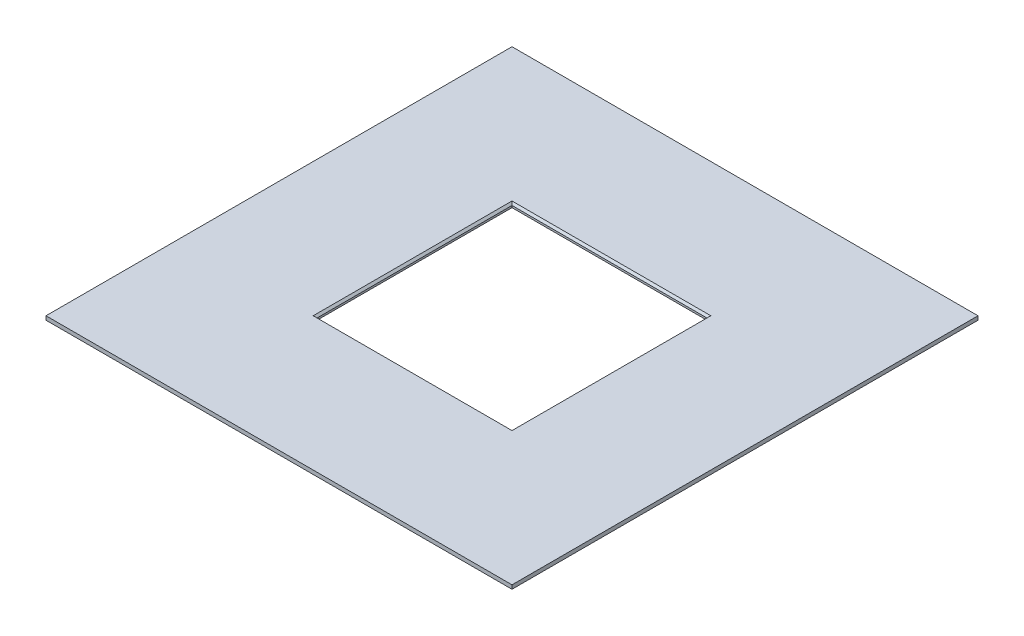
ISO-10303-21;
HEADER;
FILE_DESCRIPTION(('STEP AP214'),'2;1');
FILE_NAME('part.step','',(''),(''),'','','');
FILE_SCHEMA(('AUTOMOTIVE_DESIGN { 1 0 10303 214 1 1 1 1 }'));
ENDSEC;
DATA;
#1=APPLICATION_CONTEXT('core data for automotive mechanical design processes');
#2=APPLICATION_PROTOCOL_DEFINITION('international standard','automotive_design',2000,#1);
#3=PRODUCT_CONTEXT('',#1,'mechanical');
#4=PRODUCT('Part','Part','',(#3));
#5=PRODUCT_RELATED_PRODUCT_CATEGORY('part','',(#4));
#6=PRODUCT_DEFINITION_FORMATION('','',#4);
#7=PRODUCT_DEFINITION_CONTEXT('part definition',#1,'design');
#8=PRODUCT_DEFINITION('design','',#6,#7);
#9=PRODUCT_DEFINITION_SHAPE('','',#8);
#10=(LENGTH_UNIT() NAMED_UNIT(*) SI_UNIT(.MILLI.,.METRE.));
#11=(NAMED_UNIT(*) PLANE_ANGLE_UNIT() SI_UNIT($,.RADIAN.));
#12=(NAMED_UNIT(*) SI_UNIT($,.STERADIAN.) SOLID_ANGLE_UNIT());
#13=UNCERTAINTY_MEASURE_WITH_UNIT(LENGTH_MEASURE(1.E-05),#10,'distance_accuracy_value','');
#14=(GEOMETRIC_REPRESENTATION_CONTEXT(3) GLOBAL_UNCERTAINTY_ASSIGNED_CONTEXT((#13)) GLOBAL_UNIT_ASSIGNED_CONTEXT((#10,
#11,#12)) REPRESENTATION_CONTEXT('',''));
#15=CARTESIAN_POINT('',(0.,0.,0.));
#16=DIRECTION('',(0.,0.,1.));
#17=DIRECTION('',(1.,0.,0.));
#18=AXIS2_PLACEMENT_3D('',#15,#16,#17);
#19=CARTESIAN_POINT('',(0.,1.,0.));
#20=DIRECTION('',(0.,1.,0.));
#21=DIRECTION('',(0.,0.,1.));
#22=AXIS2_PLACEMENT_3D('',#19,#20,#21);
#23=PLANE('',#22);
#24=DIRECTION('',(0.,0.,1.));
#25=VECTOR('',#24,1.);
#26=CARTESIAN_POINT('',(25.6,1.,0.));
#27=LINE('',#26,#25);
#28=CARTESIAN_POINT('',(25.6,1.,-25.6));
#29=VERTEX_POINT('',#28);
#30=CARTESIAN_POINT('',(25.6,1.,25.6));
#31=VERTEX_POINT('',#30);
#32=EDGE_CURVE('E210',#29,#31,#27,.T.);
#33=ORIENTED_EDGE('',*,*,#32,.T.);
#34=DIRECTION('',(-1.,0.,0.));
#35=VECTOR('',#34,1.);
#36=CARTESIAN_POINT('',(0.,1.,25.6));
#37=LINE('',#36,#35);
#38=CARTESIAN_POINT('',(-25.6,1.,25.6));
#39=VERTEX_POINT('',#38);
#40=EDGE_CURVE('E213',#31,#39,#37,.T.);
#41=ORIENTED_EDGE('',*,*,#40,.T.);
#42=DIRECTION('',(0.,0.,-1.));
#43=VECTOR('',#42,1.);
#44=CARTESIAN_POINT('',(-25.6,1.,0.));
#45=LINE('',#44,#43);
#46=CARTESIAN_POINT('',(-25.6,1.,-25.6));
#47=VERTEX_POINT('',#46);
#48=EDGE_CURVE('E204',#39,#47,#45,.T.);
#49=ORIENTED_EDGE('',*,*,#48,.T.);
#50=DIRECTION('',(1.,0.,0.));
#51=VECTOR('',#50,1.);
#52=CARTESIAN_POINT('',(0.,1.,-25.6));
#53=LINE('',#52,#51);
#54=EDGE_CURVE('E207',#47,#29,#53,.T.);
#55=ORIENTED_EDGE('',*,*,#54,.T.);
#56=EDGE_LOOP('',(#33,#41,#49,#55));
#57=FACE_BOUND('',#56,.T.);
#58=DIRECTION('',(0.,0.,-1.));
#59=VECTOR('',#58,1.);
#60=CARTESIAN_POINT('',(60.,1.,-60.));
#61=LINE('',#60,#59);
#62=CARTESIAN_POINT('',(60.,1.,60.));
#63=VERTEX_POINT('',#62);
#64=CARTESIAN_POINT('',(60.,1.,-60.));
#65=VERTEX_POINT('',#64);
#66=EDGE_CURVE('E159',#63,#65,#61,.T.);
#67=ORIENTED_EDGE('',*,*,#66,.T.);
#68=DIRECTION('',(-1.,0.,0.));
#69=VECTOR('',#68,1.);
#70=CARTESIAN_POINT('',(-60.,1.,-60.));
#71=LINE('',#70,#69);
#72=CARTESIAN_POINT('',(-60.,1.,-60.));
#73=VERTEX_POINT('',#72);
#74=EDGE_CURVE('E163',#65,#73,#71,.T.);
#75=ORIENTED_EDGE('',*,*,#74,.T.);
#76=DIRECTION('',(0.,0.,1.));
#77=VECTOR('',#76,1.);
#78=CARTESIAN_POINT('',(-60.,1.,-60.));
#79=LINE('',#78,#77);
#80=CARTESIAN_POINT('',(-60.,1.,60.));
#81=VERTEX_POINT('',#80);
#82=EDGE_CURVE('E167',#73,#81,#79,.T.);
#83=ORIENTED_EDGE('',*,*,#82,.T.);
#84=DIRECTION('',(1.,0.,0.));
#85=VECTOR('',#84,1.);
#86=CARTESIAN_POINT('',(-60.,1.,60.));
#87=LINE('',#86,#85);
#88=EDGE_CURVE('E170',#81,#63,#87,.T.);
#89=ORIENTED_EDGE('',*,*,#88,.T.);
#90=EDGE_LOOP('',(#67,#75,#83,#89));
#91=FACE_BOUND('',#90,.T.);
#92=ADVANCED_FACE('F41',(#57,#91),#23,.T.);
#93=CARTESIAN_POINT('',(0.,0.,0.));
#94=DIRECTION('',(0.,1.,0.));
#95=DIRECTION('',(0.,0.,1.));
#96=AXIS2_PLACEMENT_3D('',#93,#94,#95);
#97=PLANE('',#96);
#98=DIRECTION('',(0.,0.,-1.));
#99=VECTOR('',#98,1.);
#100=CARTESIAN_POINT('',(60.,0.,-60.));
#101=LINE('',#100,#99);
#102=CARTESIAN_POINT('',(60.,0.,60.));
#103=VERTEX_POINT('',#102);
#104=CARTESIAN_POINT('',(60.,0.,-60.));
#105=VERTEX_POINT('',#104);
#106=EDGE_CURVE('E126',#103,#105,#101,.T.);
#107=ORIENTED_EDGE('',*,*,#106,.F.);
#108=DIRECTION('',(1.,0.,0.));
#109=VECTOR('',#108,1.);
#110=CARTESIAN_POINT('',(-60.,0.,60.));
#111=LINE('',#110,#109);
#112=CARTESIAN_POINT('',(-60.,0.,60.));
#113=VERTEX_POINT('',#112);
#114=EDGE_CURVE('E164',#113,#103,#111,.T.);
#115=ORIENTED_EDGE('',*,*,#114,.F.);
#116=DIRECTION('',(0.,0.,1.));
#117=VECTOR('',#116,1.);
#118=CARTESIAN_POINT('',(-60.,0.,-60.));
#119=LINE('',#118,#117);
#120=CARTESIAN_POINT('',(-60.,0.,-60.));
#121=VERTEX_POINT('',#120);
#122=EDGE_CURVE('E180',#121,#113,#119,.T.);
#123=ORIENTED_EDGE('',*,*,#122,.F.);
#124=DIRECTION('',(-1.,0.,0.));
#125=VECTOR('',#124,1.);
#126=CARTESIAN_POINT('',(-60.,0.,-60.));
#127=LINE('',#126,#125);
#128=EDGE_CURVE('E177',#105,#121,#127,.T.);
#129=ORIENTED_EDGE('',*,*,#128,.F.);
#130=EDGE_LOOP('',(#107,#115,#123,#129));
#131=FACE_BOUND('',#130,.T.);
#132=DIRECTION('',(0.,0.,-1.));
#133=VECTOR('',#132,1.);
#134=CARTESIAN_POINT('',(25.1,0.,-25.1));
#135=LINE('',#134,#133);
#136=CARTESIAN_POINT('',(25.1,0.,25.1));
#137=VERTEX_POINT('',#136);
#138=CARTESIAN_POINT('',(25.1,0.,-25.1));
#139=VERTEX_POINT('',#138);
#140=EDGE_CURVE('E123',#137,#139,#135,.T.);
#141=ORIENTED_EDGE('',*,*,#140,.T.);
#142=DIRECTION('',(-1.,0.,0.));
#143=VECTOR('',#142,1.);
#144=CARTESIAN_POINT('',(-25.1,0.,-25.1));
#145=LINE('',#144,#143);
#146=CARTESIAN_POINT('',(-25.1,0.,-25.1));
#147=VERTEX_POINT('',#146);
#148=EDGE_CURVE('E130',#139,#147,#145,.T.);
#149=ORIENTED_EDGE('',*,*,#148,.T.);
#150=DIRECTION('',(0.,0.,1.));
#151=VECTOR('',#150,1.);
#152=CARTESIAN_POINT('',(-25.1,0.,-25.1));
#153=LINE('',#152,#151);
#154=CARTESIAN_POINT('',(-25.1,0.,25.1));
#155=VERTEX_POINT('',#154);
#156=EDGE_CURVE('E136',#147,#155,#153,.T.);
#157=ORIENTED_EDGE('',*,*,#156,.T.);
#158=DIRECTION('',(1.,0.,0.));
#159=VECTOR('',#158,1.);
#160=CARTESIAN_POINT('',(-25.1,0.,25.1));
#161=LINE('',#160,#159);
#162=EDGE_CURVE('E140',#155,#137,#161,.T.);
#163=ORIENTED_EDGE('',*,*,#162,.T.);
#164=EDGE_LOOP('',(#141,#149,#157,#163));
#165=FACE_BOUND('',#164,.T.);
#166=ADVANCED_FACE('F138',(#131,#165),#97,.F.);
#167=CARTESIAN_POINT('',(60.,1.,-60.));
#168=DIRECTION('',(-1.,0.,0.));
#169=DIRECTION('',(0.,0.,1.));
#170=AXIS2_PLACEMENT_3D('',#167,#168,#169);
#171=PLANE('',#170);
#172=ORIENTED_EDGE('',*,*,#106,.T.);
#173=DIRECTION('',(0.,-1.,0.));
#174=VECTOR('',#173,1.);
#175=CARTESIAN_POINT('',(60.,1.,-60.));
#176=LINE('',#175,#174);
#177=EDGE_CURVE('E196',#65,#105,#176,.T.);
#178=ORIENTED_EDGE('',*,*,#177,.F.);
#179=ORIENTED_EDGE('',*,*,#66,.F.);
#180=DIRECTION('',(0.,-1.,0.));
#181=VECTOR('',#180,1.);
#182=CARTESIAN_POINT('',(60.,1.,60.));
#183=LINE('',#182,#181);
#184=EDGE_CURVE('E173',#63,#103,#183,.T.);
#185=ORIENTED_EDGE('',*,*,#184,.T.);
#186=EDGE_LOOP('',(#172,#178,#179,#185));
#187=FACE_BOUND('',#186,.T.);
#188=ADVANCED_FACE('F260',(#187),#171,.F.);
#189=CARTESIAN_POINT('',(-60.,1.,-60.));
#190=DIRECTION('',(0.,0.,1.));
#191=DIRECTION('',(1.,0.,0.));
#192=AXIS2_PLACEMENT_3D('',#189,#190,#191);
#193=PLANE('',#192);
#194=ORIENTED_EDGE('',*,*,#128,.T.);
#195=DIRECTION('',(0.,-1.,0.));
#196=VECTOR('',#195,1.);
#197=CARTESIAN_POINT('',(-60.,1.,-60.));
#198=LINE('',#197,#196);
#199=EDGE_CURVE('E192',#73,#121,#198,.T.);
#200=ORIENTED_EDGE('',*,*,#199,.F.);
#201=ORIENTED_EDGE('',*,*,#74,.F.);
#202=ORIENTED_EDGE('',*,*,#177,.T.);
#203=EDGE_LOOP('',(#194,#200,#201,#202));
#204=FACE_BOUND('',#203,.T.);
#205=ADVANCED_FACE('F263',(#204),#193,.F.);
#206=CARTESIAN_POINT('',(-60.,1.,-60.));
#207=DIRECTION('',(1.,0.,0.));
#208=DIRECTION('',(0.,0.,-1.));
#209=AXIS2_PLACEMENT_3D('',#206,#207,#208);
#210=PLANE('',#209);
#211=ORIENTED_EDGE('',*,*,#122,.T.);
#212=DIRECTION('',(0.,-1.,0.));
#213=VECTOR('',#212,1.);
#214=CARTESIAN_POINT('',(-60.,1.,60.));
#215=LINE('',#214,#213);
#216=EDGE_CURVE('E188',#81,#113,#215,.T.);
#217=ORIENTED_EDGE('',*,*,#216,.F.);
#218=ORIENTED_EDGE('',*,*,#82,.F.);
#219=ORIENTED_EDGE('',*,*,#199,.T.);
#220=EDGE_LOOP('',(#211,#217,#218,#219));
#221=FACE_BOUND('',#220,.T.);
#222=ADVANCED_FACE('F268',(#221),#210,.F.);
#223=CARTESIAN_POINT('',(-60.,1.,60.));
#224=DIRECTION('',(0.,0.,-1.));
#225=DIRECTION('',(-1.,0.,0.));
#226=AXIS2_PLACEMENT_3D('',#223,#224,#225);
#227=PLANE('',#226);
#228=ORIENTED_EDGE('',*,*,#114,.T.);
#229=ORIENTED_EDGE('',*,*,#184,.F.);
#230=ORIENTED_EDGE('',*,*,#88,.F.);
#231=ORIENTED_EDGE('',*,*,#216,.T.);
#232=EDGE_LOOP('',(#228,#229,#230,#231));
#233=FACE_BOUND('',#232,.T.);
#234=ADVANCED_FACE('F271',(#233),#227,.F.);
#235=CARTESIAN_POINT('',(25.1,1.,-25.1));
#236=DIRECTION('',(-1.,0.,0.));
#237=DIRECTION('',(0.,0.,1.));
#238=AXIS2_PLACEMENT_3D('',#235,#236,#237);
#239=PLANE('',#238);
#240=DIRECTION('',(0.,-1.,0.));
#241=VECTOR('',#240,1.);
#242=CARTESIAN_POINT('',(25.1,1.,25.1));
#243=LINE('',#242,#241);
#244=CARTESIAN_POINT('',(25.1,0.5,25.1));
#245=VERTEX_POINT('',#244);
#246=EDGE_CURVE('E151',#245,#137,#243,.T.);
#247=ORIENTED_EDGE('',*,*,#246,.F.);
#248=DIRECTION('',(0.,0.,-1.));
#249=VECTOR('',#248,1.);
#250=CARTESIAN_POINT('',(25.1,0.5,-25.1));
#251=LINE('',#250,#249);
#252=CARTESIAN_POINT('',(25.1,0.5,-25.1));
#253=VERTEX_POINT('',#252);
#254=EDGE_CURVE('E67',#245,#253,#251,.T.);
#255=ORIENTED_EDGE('',*,*,#254,.T.);
#256=DIRECTION('',(0.,-1.,0.));
#257=VECTOR('',#256,1.);
#258=CARTESIAN_POINT('',(25.1,1.,-25.1));
#259=LINE('',#258,#257);
#260=EDGE_CURVE('E119',#253,#139,#259,.T.);
#261=ORIENTED_EDGE('',*,*,#260,.T.);
#262=ORIENTED_EDGE('',*,*,#140,.F.);
#263=EDGE_LOOP('',(#247,#255,#261,#262));
#264=FACE_BOUND('',#263,.T.);
#265=ADVANCED_FACE('F121',(#264),#239,.T.);
#266=CARTESIAN_POINT('',(-25.1,1.,-25.1));
#267=DIRECTION('',(0.,0.,1.));
#268=DIRECTION('',(1.,0.,0.));
#269=AXIS2_PLACEMENT_3D('',#266,#267,#268);
#270=PLANE('',#269);
#271=ORIENTED_EDGE('',*,*,#260,.F.);
#272=DIRECTION('',(-1.,0.,0.));
#273=VECTOR('',#272,1.);
#274=CARTESIAN_POINT('',(-25.1,0.5,-25.1));
#275=LINE('',#274,#273);
#276=CARTESIAN_POINT('',(-25.1,0.5,-25.1));
#277=VERTEX_POINT('',#276);
#278=EDGE_CURVE('E52',#253,#277,#275,.T.);
#279=ORIENTED_EDGE('',*,*,#278,.T.);
#280=DIRECTION('',(0.,-1.,0.));
#281=VECTOR('',#280,1.);
#282=CARTESIAN_POINT('',(-25.1,1.,-25.1));
#283=LINE('',#282,#281);
#284=EDGE_CURVE('E127',#277,#147,#283,.T.);
#285=ORIENTED_EDGE('',*,*,#284,.T.);
#286=ORIENTED_EDGE('',*,*,#148,.F.);
#287=EDGE_LOOP('',(#271,#279,#285,#286));
#288=FACE_BOUND('',#287,.T.);
#289=ADVANCED_FACE('F131',(#288),#270,.T.);
#290=CARTESIAN_POINT('',(-25.1,1.,-25.1));
#291=DIRECTION('',(1.,0.,0.));
#292=DIRECTION('',(0.,0.,-1.));
#293=AXIS2_PLACEMENT_3D('',#290,#291,#292);
#294=PLANE('',#293);
#295=ORIENTED_EDGE('',*,*,#284,.F.);
#296=DIRECTION('',(0.,0.,1.));
#297=VECTOR('',#296,1.);
#298=CARTESIAN_POINT('',(-25.1,0.5,-25.1));
#299=LINE('',#298,#297);
#300=CARTESIAN_POINT('',(-25.1,0.5,25.1));
#301=VERTEX_POINT('',#300);
#302=EDGE_CURVE('E11',#277,#301,#299,.T.);
#303=ORIENTED_EDGE('',*,*,#302,.T.);
#304=DIRECTION('',(0.,-1.,0.));
#305=VECTOR('',#304,1.);
#306=CARTESIAN_POINT('',(-25.1,1.,25.1));
#307=LINE('',#306,#305);
#308=EDGE_CURVE('E154',#301,#155,#307,.T.);
#309=ORIENTED_EDGE('',*,*,#308,.T.);
#310=ORIENTED_EDGE('',*,*,#156,.F.);
#311=EDGE_LOOP('',(#295,#303,#309,#310));
#312=FACE_BOUND('',#311,.T.);
#313=ADVANCED_FACE('F244',(#312),#294,.T.);
#314=CARTESIAN_POINT('',(-25.1,1.,25.1));
#315=DIRECTION('',(0.,0.,-1.));
#316=DIRECTION('',(-1.,0.,0.));
#317=AXIS2_PLACEMENT_3D('',#314,#315,#316);
#318=PLANE('',#317);
#319=ORIENTED_EDGE('',*,*,#308,.F.);
#320=DIRECTION('',(1.,0.,0.));
#321=VECTOR('',#320,1.);
#322=CARTESIAN_POINT('',(-25.1,0.5,25.1));
#323=LINE('',#322,#321);
#324=EDGE_CURVE('E200',#301,#245,#323,.T.);
#325=ORIENTED_EDGE('',*,*,#324,.T.);
#326=ORIENTED_EDGE('',*,*,#246,.T.);
#327=ORIENTED_EDGE('',*,*,#162,.F.);
#328=EDGE_LOOP('',(#319,#325,#326,#327));
#329=FACE_BOUND('',#328,.T.);
#330=ADVANCED_FACE('F246',(#329),#318,.T.);
#331=CARTESIAN_POINT('',(-25.1,0.5,-25.1));
#332=DIRECTION('',(0.,-0.707106781186547,-0.707106781186547));
#333=DIRECTION('',(-1.,0.,0.));
#334=AXIS2_PLACEMENT_3D('',#331,#332,#333);
#335=PLANE('',#334);
#336=DIRECTION('',(0.577350269189626,0.577350269189626,-0.577350269189626));
#337=VECTOR('',#336,1.);
#338=CARTESIAN_POINT('',(25.1,0.5,-25.1));
#339=LINE('',#338,#337);
#340=EDGE_CURVE('E145',#29,#253,#339,.F.);
#341=ORIENTED_EDGE('',*,*,#340,.F.);
#342=ORIENTED_EDGE('',*,*,#54,.F.);
#343=DIRECTION('',(-0.577350269189626,0.577350269189626,-0.577350269189626));
#344=VECTOR('',#343,1.);
#345=CARTESIAN_POINT('',(-25.1,0.5,-25.1));
#346=LINE('',#345,#344);
#347=EDGE_CURVE('E46',#277,#47,#346,.T.);
#348=ORIENTED_EDGE('',*,*,#347,.F.);
#349=ORIENTED_EDGE('',*,*,#278,.F.);
#350=EDGE_LOOP('',(#341,#342,#348,#349));
#351=FACE_BOUND('',#350,.T.);
#352=ADVANCED_FACE('F44',(#351),#335,.F.);
#353=CARTESIAN_POINT('',(-25.1,0.5,-25.1));
#354=DIRECTION('',(-0.707106781186547,-0.707106781186547,0.));
#355=DIRECTION('',(0.,0.,1.));
#356=AXIS2_PLACEMENT_3D('',#353,#354,#355);
#357=PLANE('',#356);
#358=ORIENTED_EDGE('',*,*,#347,.T.);
#359=ORIENTED_EDGE('',*,*,#48,.F.);
#360=DIRECTION('',(0.577350269189626,-0.577350269189626,-0.577350269189626));
#361=VECTOR('',#360,1.);
#362=CARTESIAN_POINT('',(-25.1,0.5,25.1));
#363=LINE('',#362,#361);
#364=EDGE_CURVE('E224',#301,#39,#363,.F.);
#365=ORIENTED_EDGE('',*,*,#364,.F.);
#366=ORIENTED_EDGE('',*,*,#302,.F.);
#367=EDGE_LOOP('',(#358,#359,#365,#366));
#368=FACE_BOUND('',#367,.T.);
#369=ADVANCED_FACE('F240',(#368),#357,.F.);
#370=CARTESIAN_POINT('',(25.1,0.5,-25.1));
#371=DIRECTION('',(0.707106781186547,-0.707106781186547,0.));
#372=DIRECTION('',(0.,0.,-1.));
#373=AXIS2_PLACEMENT_3D('',#370,#371,#372);
#374=PLANE('',#373);
#375=ORIENTED_EDGE('',*,*,#340,.T.);
#376=ORIENTED_EDGE('',*,*,#254,.F.);
#377=DIRECTION('',(0.577350269189626,0.577350269189626,0.577350269189626));
#378=VECTOR('',#377,1.);
#379=CARTESIAN_POINT('',(8.36666666666667,-16.2333333333333,8.36666666666666));
#380=LINE('',#379,#378);
#381=EDGE_CURVE('E221',#31,#245,#380,.F.);
#382=ORIENTED_EDGE('',*,*,#381,.F.);
#383=ORIENTED_EDGE('',*,*,#32,.F.);
#384=EDGE_LOOP('',(#375,#376,#382,#383));
#385=FACE_BOUND('',#384,.T.);
#386=ADVANCED_FACE('F231',(#385),#374,.F.);
#387=CARTESIAN_POINT('',(-25.1,0.5,25.1));
#388=DIRECTION('',(0.,-0.707106781186547,0.707106781186547));
#389=DIRECTION('',(1.,0.,0.));
#390=AXIS2_PLACEMENT_3D('',#387,#388,#389);
#391=PLANE('',#390);
#392=ORIENTED_EDGE('',*,*,#364,.T.);
#393=ORIENTED_EDGE('',*,*,#40,.F.);
#394=ORIENTED_EDGE('',*,*,#381,.T.);
#395=ORIENTED_EDGE('',*,*,#324,.F.);
#396=EDGE_LOOP('',(#392,#393,#394,#395));
#397=FACE_BOUND('',#396,.T.);
#398=ADVANCED_FACE('F248',(#397),#391,.F.);
#399=CLOSED_SHELL('',(#92,#166,#188,#205,#222,#234,#265,#289,#313,#330,#352,#369,#386,#398));
#400=MANIFOLD_SOLID_BREP('B2',#399);
#401=ADVANCED_BREP_SHAPE_REPRESENTATION('',(#18,#400),#14);
#402=SHAPE_DEFINITION_REPRESENTATION(#9,#401);
ENDSEC;
END-ISO-10303-21;
